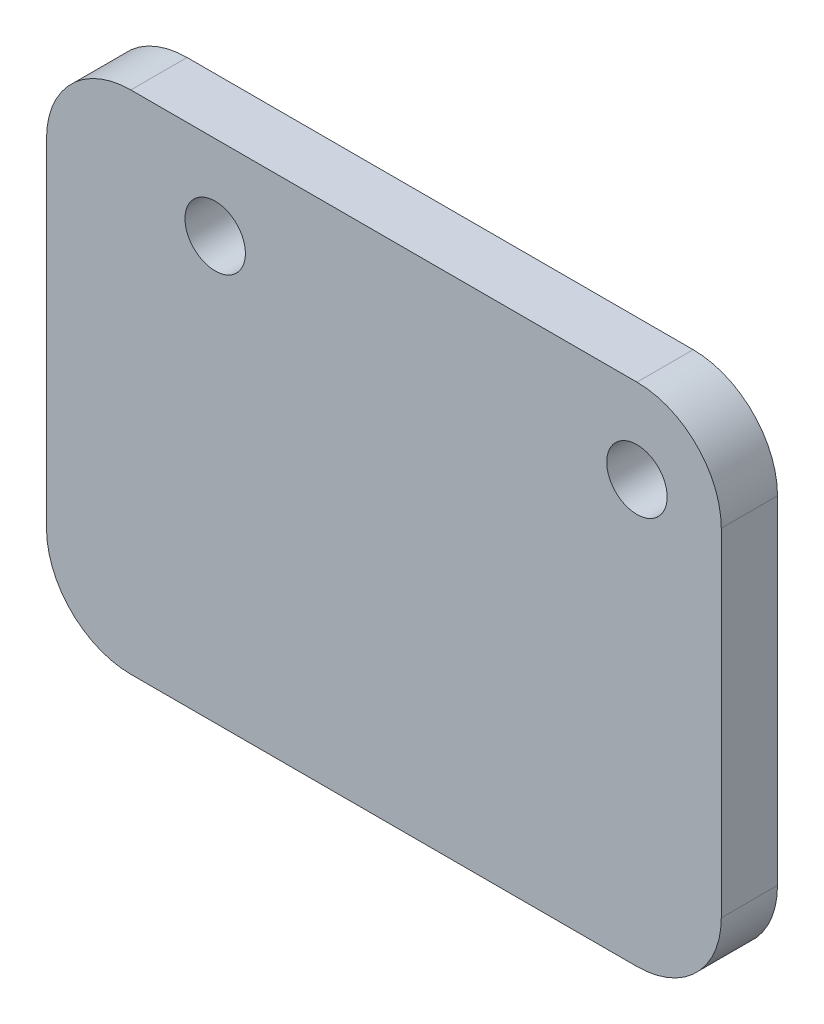
ISO-10303-21;
HEADER;
FILE_DESCRIPTION(('STEP AP214'),'2;1');
FILE_NAME('part.step','',(''),(''),'','','');
FILE_SCHEMA(('AUTOMOTIVE_DESIGN { 1 0 10303 214 1 1 1 1 }'));
ENDSEC;
DATA;
#1=APPLICATION_CONTEXT('core data for automotive mechanical design processes');
#2=APPLICATION_PROTOCOL_DEFINITION('international standard','automotive_design',2000,#1);
#3=PRODUCT_CONTEXT('',#1,'mechanical');
#4=PRODUCT('Part','Part','',(#3));
#5=PRODUCT_RELATED_PRODUCT_CATEGORY('part','',(#4));
#6=PRODUCT_DEFINITION_FORMATION('','',#4);
#7=PRODUCT_DEFINITION_CONTEXT('part definition',#1,'design');
#8=PRODUCT_DEFINITION('design','',#6,#7);
#9=PRODUCT_DEFINITION_SHAPE('','',#8);
#10=(LENGTH_UNIT() NAMED_UNIT(*) SI_UNIT(.MILLI.,.METRE.));
#11=(NAMED_UNIT(*) PLANE_ANGLE_UNIT() SI_UNIT($,.RADIAN.));
#12=(NAMED_UNIT(*) SI_UNIT($,.STERADIAN.) SOLID_ANGLE_UNIT());
#13=UNCERTAINTY_MEASURE_WITH_UNIT(LENGTH_MEASURE(1.E-05),#10,'distance_accuracy_value','');
#14=(GEOMETRIC_REPRESENTATION_CONTEXT(3) GLOBAL_UNCERTAINTY_ASSIGNED_CONTEXT((#13)) GLOBAL_UNIT_ASSIGNED_CONTEXT((#10,
#11,#12)) REPRESENTATION_CONTEXT('',''));
#15=CARTESIAN_POINT('',(0.,0.,0.));
#16=DIRECTION('',(0.,0.,1.));
#17=DIRECTION('',(1.,0.,0.));
#18=AXIS2_PLACEMENT_3D('',#15,#16,#17);
#19=CARTESIAN_POINT('',(21.,-15.,2.));
#20=DIRECTION('',(0.,0.,-1.));
#21=DIRECTION('',(-1.,0.,0.));
#22=AXIS2_PLACEMENT_3D('',#19,#20,#21);
#23=CYLINDRICAL_SURFACE('',#22,3.);
#24=DIRECTION('',(0.,0.,-1.));
#25=VECTOR('',#24,1.);
#26=CARTESIAN_POINT('',(24.,-15.,2.));
#27=LINE('',#26,#25);
#28=CARTESIAN_POINT('',(24.,-15.,2.));
#29=VERTEX_POINT('',#28);
#30=CARTESIAN_POINT('',(24.,-15.,0.));
#31=VERTEX_POINT('',#30);
#32=EDGE_CURVE('E152',#29,#31,#27,.T.);
#33=ORIENTED_EDGE('',*,*,#32,.F.);
#34=CARTESIAN_POINT('',(21.,-15.,2.));
#35=DIRECTION('',(0.,0.,-1.));
#36=DIRECTION('',(-1.,0.,0.));
#37=AXIS2_PLACEMENT_3D('',#34,#35,#36);
#38=CIRCLE('',#37,3.);
#39=CARTESIAN_POINT('',(21.,-18.,2.));
#40=VERTEX_POINT('',#39);
#41=EDGE_CURVE('E42',#40,#29,#38,.F.);
#42=ORIENTED_EDGE('',*,*,#41,.F.);
#43=DIRECTION('',(0.,0.,-1.));
#44=VECTOR('',#43,1.);
#45=CARTESIAN_POINT('',(21.,-18.,2.));
#46=LINE('',#45,#44);
#47=CARTESIAN_POINT('',(21.,-18.,0.));
#48=VERTEX_POINT('',#47);
#49=EDGE_CURVE('E155',#48,#40,#46,.F.);
#50=ORIENTED_EDGE('',*,*,#49,.F.);
#51=CARTESIAN_POINT('',(21.,-15.,0.));
#52=DIRECTION('',(0.,0.,-1.));
#53=DIRECTION('',(-1.,0.,0.));
#54=AXIS2_PLACEMENT_3D('',#51,#52,#53);
#55=CIRCLE('',#54,3.);
#56=EDGE_CURVE('E11',#31,#48,#55,.T.);
#57=ORIENTED_EDGE('',*,*,#56,.F.);
#58=EDGE_LOOP('',(#33,#42,#50,#57));
#59=FACE_BOUND('',#58,.T.);
#60=ADVANCED_FACE('F35',(#59),#23,.T.);
#61=CARTESIAN_POINT('',(3.,-15.,2.));
#62=DIRECTION('',(0.,0.,1.));
#63=DIRECTION('',(1.,0.,0.));
#64=AXIS2_PLACEMENT_3D('',#61,#62,#63);
#65=CYLINDRICAL_SURFACE('',#64,3.);
#66=DIRECTION('',(0.,0.,1.));
#67=VECTOR('',#66,1.);
#68=CARTESIAN_POINT('',(0.,-15.,2.));
#69=LINE('',#68,#67);
#70=CARTESIAN_POINT('',(0.,-15.,0.));
#71=VERTEX_POINT('',#70);
#72=CARTESIAN_POINT('',(0.,-15.,2.));
#73=VERTEX_POINT('',#72);
#74=EDGE_CURVE('E142',#71,#73,#69,.T.);
#75=ORIENTED_EDGE('',*,*,#74,.F.);
#76=CARTESIAN_POINT('',(3.,-15.,0.));
#77=DIRECTION('',(0.,0.,-1.));
#78=DIRECTION('',(-1.,0.,0.));
#79=AXIS2_PLACEMENT_3D('',#76,#77,#78);
#80=CIRCLE('',#79,3.);
#81=CARTESIAN_POINT('',(3.00000000000001,-18.,0.));
#82=VERTEX_POINT('',#81);
#83=EDGE_CURVE('E148',#82,#71,#80,.T.);
#84=ORIENTED_EDGE('',*,*,#83,.F.);
#85=DIRECTION('',(0.,0.,1.));
#86=VECTOR('',#85,1.);
#87=CARTESIAN_POINT('',(3.,-18.,2.));
#88=LINE('',#87,#86);
#89=CARTESIAN_POINT('',(3.00000000000001,-18.,2.));
#90=VERTEX_POINT('',#89);
#91=EDGE_CURVE('E145',#90,#82,#88,.F.);
#92=ORIENTED_EDGE('',*,*,#91,.F.);
#93=CARTESIAN_POINT('',(3.,-15.,2.));
#94=DIRECTION('',(0.,0.,-1.));
#95=DIRECTION('',(-1.,0.,0.));
#96=AXIS2_PLACEMENT_3D('',#93,#94,#95);
#97=CIRCLE('',#96,3.);
#98=EDGE_CURVE('E150',#73,#90,#97,.F.);
#99=ORIENTED_EDGE('',*,*,#98,.F.);
#100=EDGE_LOOP('',(#75,#84,#92,#99));
#101=FACE_BOUND('',#100,.T.);
#102=ADVANCED_FACE('F178',(#101),#65,.T.);
#103=CARTESIAN_POINT('',(3.,-3.,2.));
#104=DIRECTION('',(0.,0.,1.));
#105=DIRECTION('',(1.,0.,0.));
#106=AXIS2_PLACEMENT_3D('',#103,#104,#105);
#107=CYLINDRICAL_SURFACE('',#106,3.);
#108=DIRECTION('',(0.,0.,1.));
#109=VECTOR('',#108,1.);
#110=CARTESIAN_POINT('',(3.,0.,2.));
#111=LINE('',#110,#109);
#112=CARTESIAN_POINT('',(3.,0.,0.));
#113=VERTEX_POINT('',#112);
#114=CARTESIAN_POINT('',(3.,0.,2.));
#115=VERTEX_POINT('',#114);
#116=EDGE_CURVE('E107',#113,#115,#111,.T.);
#117=ORIENTED_EDGE('',*,*,#116,.F.);
#118=CARTESIAN_POINT('',(3.,-3.,0.));
#119=DIRECTION('',(0.,0.,-1.));
#120=DIRECTION('',(-1.,0.,0.));
#121=AXIS2_PLACEMENT_3D('',#118,#119,#120);
#122=CIRCLE('',#121,3.);
#123=CARTESIAN_POINT('',(0.,-3.,0.));
#124=VERTEX_POINT('',#123);
#125=EDGE_CURVE('E121',#124,#113,#122,.T.);
#126=ORIENTED_EDGE('',*,*,#125,.F.);
#127=DIRECTION('',(0.,0.,1.));
#128=VECTOR('',#127,1.);
#129=CARTESIAN_POINT('',(0.,-3.,2.));
#130=LINE('',#129,#128);
#131=CARTESIAN_POINT('',(0.,-3.,2.));
#132=VERTEX_POINT('',#131);
#133=EDGE_CURVE('E136',#132,#124,#130,.F.);
#134=ORIENTED_EDGE('',*,*,#133,.F.);
#135=CARTESIAN_POINT('',(3.,-3.,2.));
#136=DIRECTION('',(0.,0.,-1.));
#137=DIRECTION('',(-1.,0.,0.));
#138=AXIS2_PLACEMENT_3D('',#135,#136,#137);
#139=CIRCLE('',#138,3.);
#140=EDGE_CURVE('E140',#115,#132,#139,.F.);
#141=ORIENTED_EDGE('',*,*,#140,.F.);
#142=EDGE_LOOP('',(#117,#126,#134,#141));
#143=FACE_BOUND('',#142,.T.);
#144=ADVANCED_FACE('F184',(#143),#107,.T.);
#145=CARTESIAN_POINT('',(21.,-3.,2.));
#146=DIRECTION('',(0.,0.,-1.));
#147=DIRECTION('',(-1.,0.,0.));
#148=AXIS2_PLACEMENT_3D('',#145,#146,#147);
#149=CYLINDRICAL_SURFACE('',#148,3.);
#150=DIRECTION('',(0.,0.,-1.));
#151=VECTOR('',#150,1.);
#152=CARTESIAN_POINT('',(21.,0.,2.));
#153=LINE('',#152,#151);
#154=CARTESIAN_POINT('',(21.,0.,2.));
#155=VERTEX_POINT('',#154);
#156=CARTESIAN_POINT('',(21.,0.,0.));
#157=VERTEX_POINT('',#156);
#158=EDGE_CURVE('E102',#155,#157,#153,.T.);
#159=ORIENTED_EDGE('',*,*,#158,.F.);
#160=CARTESIAN_POINT('',(21.,-3.,2.));
#161=DIRECTION('',(0.,0.,-1.));
#162=DIRECTION('',(-1.,0.,0.));
#163=AXIS2_PLACEMENT_3D('',#160,#161,#162);
#164=CIRCLE('',#163,3.);
#165=CARTESIAN_POINT('',(24.,-3.,2.));
#166=VERTEX_POINT('',#165);
#167=EDGE_CURVE('E108',#166,#155,#164,.F.);
#168=ORIENTED_EDGE('',*,*,#167,.F.);
#169=DIRECTION('',(0.,0.,-1.));
#170=VECTOR('',#169,1.);
#171=CARTESIAN_POINT('',(24.,-3.,2.));
#172=LINE('',#171,#170);
#173=CARTESIAN_POINT('',(24.,-3.,0.));
#174=VERTEX_POINT('',#173);
#175=EDGE_CURVE('E105',#174,#166,#172,.F.);
#176=ORIENTED_EDGE('',*,*,#175,.F.);
#177=CARTESIAN_POINT('',(21.,-3.,0.));
#178=DIRECTION('',(0.,0.,-1.));
#179=DIRECTION('',(-1.,0.,0.));
#180=AXIS2_PLACEMENT_3D('',#177,#178,#179);
#181=CIRCLE('',#180,3.);
#182=EDGE_CURVE('E98',#157,#174,#181,.T.);
#183=ORIENTED_EDGE('',*,*,#182,.F.);
#184=EDGE_LOOP('',(#159,#168,#176,#183));
#185=FACE_BOUND('',#184,.T.);
#186=ADVANCED_FACE('F100',(#185),#149,.T.);
#187=CARTESIAN_POINT('',(0.,0.,2.));
#188=DIRECTION('',(0.,0.,-1.));
#189=DIRECTION('',(-1.,0.,0.));
#190=AXIS2_PLACEMENT_3D('',#187,#188,#189);
#191=PLANE('',#190);
#192=DIRECTION('',(1.,0.,0.));
#193=VECTOR('',#192,1.);
#194=CARTESIAN_POINT('',(24.,-18.,2.));
#195=LINE('',#194,#193);
#196=EDGE_CURVE('E127',#90,#40,#195,.T.);
#197=ORIENTED_EDGE('',*,*,#196,.T.);
#198=ORIENTED_EDGE('',*,*,#41,.T.);
#199=DIRECTION('',(0.,1.,0.));
#200=VECTOR('',#199,1.);
#201=CARTESIAN_POINT('',(24.,0.,2.));
#202=LINE('',#201,#200);
#203=EDGE_CURVE('E161',#29,#166,#202,.T.);
#204=ORIENTED_EDGE('',*,*,#203,.T.);
#205=ORIENTED_EDGE('',*,*,#167,.T.);
#206=DIRECTION('',(-1.,0.,0.));
#207=VECTOR('',#206,1.);
#208=CARTESIAN_POINT('',(0.,0.,2.));
#209=LINE('',#208,#207);
#210=EDGE_CURVE('E116',#155,#115,#209,.T.);
#211=ORIENTED_EDGE('',*,*,#210,.T.);
#212=ORIENTED_EDGE('',*,*,#140,.T.);
#213=DIRECTION('',(0.,-1.,0.));
#214=VECTOR('',#213,1.);
#215=CARTESIAN_POINT('',(0.,-18.,2.));
#216=LINE('',#215,#214);
#217=EDGE_CURVE('E123',#132,#73,#216,.T.);
#218=ORIENTED_EDGE('',*,*,#217,.T.);
#219=ORIENTED_EDGE('',*,*,#98,.T.);
#220=EDGE_LOOP('',(#197,#198,#204,#205,#211,#212,#218,#219));
#221=FACE_BOUND('',#220,.T.);
#222=CARTESIAN_POINT('',(21.,-3.,2.));
#223=DIRECTION('',(0.,0.,1.));
#224=DIRECTION('',(1.,0.,0.));
#225=AXIS2_PLACEMENT_3D('',#222,#223,#224);
#226=CIRCLE('',#225,1.075);
#227=CARTESIAN_POINT('',(22.075,-3.,2.));
#228=VERTEX_POINT('',#227);
#229=EDGE_CURVE('E171',#228,#228,#226,.T.);
#230=ORIENTED_EDGE('',*,*,#229,.F.);
#231=EDGE_LOOP('',(#230));
#232=FACE_BOUND('',#231,.T.);
#233=CARTESIAN_POINT('',(6.,-3.,2.));
#234=DIRECTION('',(0.,0.,1.));
#235=DIRECTION('',(1.,0.,0.));
#236=AXIS2_PLACEMENT_3D('',#233,#234,#235);
#237=CIRCLE('',#236,1.075);
#238=CARTESIAN_POINT('',(7.075,-3.,2.));
#239=VERTEX_POINT('',#238);
#240=EDGE_CURVE('E278',#239,#239,#237,.T.);
#241=ORIENTED_EDGE('',*,*,#240,.F.);
#242=EDGE_LOOP('',(#241));
#243=FACE_BOUND('',#242,.T.);
#244=ADVANCED_FACE('F158',(#221,#232,#243),#191,.F.);
#245=CARTESIAN_POINT('',(0.,0.,0.));
#246=DIRECTION('',(0.,0.,-1.));
#247=DIRECTION('',(-1.,0.,0.));
#248=AXIS2_PLACEMENT_3D('',#245,#246,#247);
#249=PLANE('',#248);
#250=CARTESIAN_POINT('',(21.,-3.,0.));
#251=DIRECTION('',(0.,0.,1.));
#252=DIRECTION('',(1.,0.,0.));
#253=AXIS2_PLACEMENT_3D('',#250,#251,#252);
#254=CIRCLE('',#253,1.075);
#255=CARTESIAN_POINT('',(22.075,-3.,0.));
#256=VERTEX_POINT('',#255);
#257=EDGE_CURVE('E276',#256,#256,#254,.T.);
#258=ORIENTED_EDGE('',*,*,#257,.T.);
#259=EDGE_LOOP('',(#258));
#260=FACE_BOUND('',#259,.T.);
#261=DIRECTION('',(0.,1.,0.));
#262=VECTOR('',#261,1.);
#263=CARTESIAN_POINT('',(24.,0.,0.));
#264=LINE('',#263,#262);
#265=EDGE_CURVE('E124',#31,#174,#264,.T.);
#266=ORIENTED_EDGE('',*,*,#265,.F.);
#267=ORIENTED_EDGE('',*,*,#56,.T.);
#268=DIRECTION('',(1.,0.,0.));
#269=VECTOR('',#268,1.);
#270=CARTESIAN_POINT('',(24.,-18.,0.));
#271=LINE('',#270,#269);
#272=EDGE_CURVE('E129',#82,#48,#271,.T.);
#273=ORIENTED_EDGE('',*,*,#272,.F.);
#274=ORIENTED_EDGE('',*,*,#83,.T.);
#275=DIRECTION('',(0.,-1.,0.));
#276=VECTOR('',#275,1.);
#277=CARTESIAN_POINT('',(0.,-18.,0.));
#278=LINE('',#277,#276);
#279=EDGE_CURVE('E169',#124,#71,#278,.T.);
#280=ORIENTED_EDGE('',*,*,#279,.F.);
#281=ORIENTED_EDGE('',*,*,#125,.T.);
#282=DIRECTION('',(-1.,0.,0.));
#283=VECTOR('',#282,1.);
#284=CARTESIAN_POINT('',(0.,0.,0.));
#285=LINE('',#284,#283);
#286=EDGE_CURVE('E114',#157,#113,#285,.T.);
#287=ORIENTED_EDGE('',*,*,#286,.F.);
#288=ORIENTED_EDGE('',*,*,#182,.T.);
#289=EDGE_LOOP('',(#266,#267,#273,#274,#280,#281,#287,#288));
#290=FACE_BOUND('',#289,.T.);
#291=CARTESIAN_POINT('',(6.,-3.,0.));
#292=DIRECTION('',(0.,0.,1.));
#293=DIRECTION('',(1.,0.,0.));
#294=AXIS2_PLACEMENT_3D('',#291,#292,#293);
#295=CIRCLE('',#294,1.075);
#296=CARTESIAN_POINT('',(7.075,-3.,0.));
#297=VERTEX_POINT('',#296);
#298=EDGE_CURVE('E283',#297,#297,#295,.T.);
#299=ORIENTED_EDGE('',*,*,#298,.T.);
#300=EDGE_LOOP('',(#299));
#301=FACE_BOUND('',#300,.T.);
#302=ADVANCED_FACE('F118',(#260,#290,#301),#249,.T.);
#303=CARTESIAN_POINT('',(0.,-18.,2.));
#304=DIRECTION('',(1.,0.,0.));
#305=DIRECTION('',(0.,0.,-1.));
#306=AXIS2_PLACEMENT_3D('',#303,#304,#305);
#307=PLANE('',#306);
#308=ORIENTED_EDGE('',*,*,#279,.T.);
#309=ORIENTED_EDGE('',*,*,#74,.T.);
#310=ORIENTED_EDGE('',*,*,#217,.F.);
#311=ORIENTED_EDGE('',*,*,#133,.T.);
#312=EDGE_LOOP('',(#308,#309,#310,#311));
#313=FACE_BOUND('',#312,.T.);
#314=ADVANCED_FACE('F181',(#313),#307,.F.);
#315=CARTESIAN_POINT('',(24.,-18.,2.));
#316=DIRECTION('',(0.,1.,0.));
#317=DIRECTION('',(-1.,0.,0.));
#318=AXIS2_PLACEMENT_3D('',#315,#316,#317);
#319=PLANE('',#318);
#320=ORIENTED_EDGE('',*,*,#272,.T.);
#321=ORIENTED_EDGE('',*,*,#49,.T.);
#322=ORIENTED_EDGE('',*,*,#196,.F.);
#323=ORIENTED_EDGE('',*,*,#91,.T.);
#324=EDGE_LOOP('',(#320,#321,#322,#323));
#325=FACE_BOUND('',#324,.T.);
#326=ADVANCED_FACE('F174',(#325),#319,.F.);
#327=CARTESIAN_POINT('',(24.,0.,2.));
#328=DIRECTION('',(-1.,0.,0.));
#329=DIRECTION('',(0.,-1.,0.));
#330=AXIS2_PLACEMENT_3D('',#327,#328,#329);
#331=PLANE('',#330);
#332=ORIENTED_EDGE('',*,*,#203,.F.);
#333=ORIENTED_EDGE('',*,*,#32,.T.);
#334=ORIENTED_EDGE('',*,*,#265,.T.);
#335=ORIENTED_EDGE('',*,*,#175,.T.);
#336=EDGE_LOOP('',(#332,#333,#334,#335));
#337=FACE_BOUND('',#336,.T.);
#338=ADVANCED_FACE('F164',(#337),#331,.F.);
#339=CARTESIAN_POINT('',(0.,0.,2.));
#340=DIRECTION('',(0.,-1.,0.));
#341=DIRECTION('',(0.,0.,-1.));
#342=AXIS2_PLACEMENT_3D('',#339,#340,#341);
#343=PLANE('',#342);
#344=ORIENTED_EDGE('',*,*,#286,.T.);
#345=ORIENTED_EDGE('',*,*,#116,.T.);
#346=ORIENTED_EDGE('',*,*,#210,.F.);
#347=ORIENTED_EDGE('',*,*,#158,.T.);
#348=EDGE_LOOP('',(#344,#345,#346,#347));
#349=FACE_BOUND('',#348,.T.);
#350=ADVANCED_FACE('F112',(#349),#343,.F.);
#351=CARTESIAN_POINT('',(21.,-3.,2.));
#352=DIRECTION('',(0.,0.,-1.));
#353=DIRECTION('',(-1.,0.,0.));
#354=AXIS2_PLACEMENT_3D('',#351,#352,#353);
#355=CYLINDRICAL_SURFACE('',#354,1.075);
#356=ORIENTED_EDGE('',*,*,#229,.T.);
#357=EDGE_LOOP('',(#356));
#358=FACE_BOUND('',#357,.T.);
#359=ORIENTED_EDGE('',*,*,#257,.F.);
#360=EDGE_LOOP('',(#359));
#361=FACE_BOUND('',#360,.T.);
#362=ADVANCED_FACE('F236',(#358,#361),#355,.F.);
#363=CARTESIAN_POINT('',(6.,-3.,2.));
#364=DIRECTION('',(0.,0.,-1.));
#365=DIRECTION('',(-1.,0.,0.));
#366=AXIS2_PLACEMENT_3D('',#363,#364,#365);
#367=CYLINDRICAL_SURFACE('',#366,1.075);
#368=ORIENTED_EDGE('',*,*,#240,.T.);
#369=EDGE_LOOP('',(#368));
#370=FACE_BOUND('',#369,.T.);
#371=ORIENTED_EDGE('',*,*,#298,.F.);
#372=EDGE_LOOP('',(#371));
#373=FACE_BOUND('',#372,.T.);
#374=ADVANCED_FACE('F241',(#370,#373),#367,.F.);
#375=CLOSED_SHELL('',(#60,#102,#144,#186,#244,#302,#314,#326,#338,#350,#362,#374));
#376=MANIFOLD_SOLID_BREP('B2',#375);
#377=ADVANCED_BREP_SHAPE_REPRESENTATION('',(#18,#376),#14);
#378=SHAPE_DEFINITION_REPRESENTATION(#9,#377);
ENDSEC;
END-ISO-10303-21;
